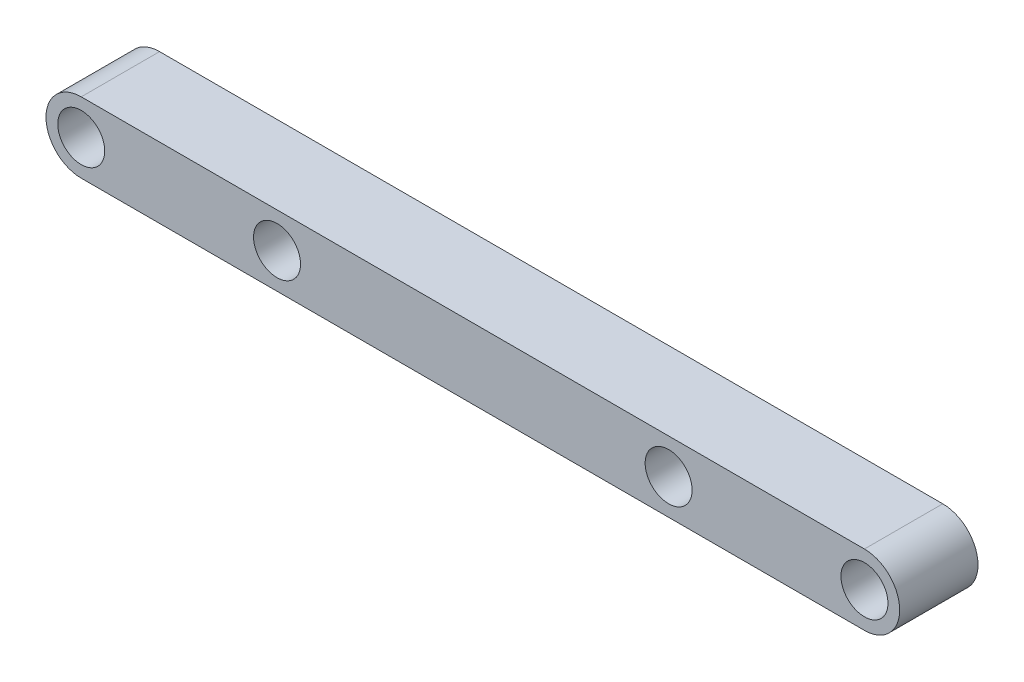
ISO-10303-21;
HEADER;
FILE_DESCRIPTION(('STEP AP214'),'2;1');
FILE_NAME('part.step','',(''),(''),'','','');
FILE_SCHEMA(('AUTOMOTIVE_DESIGN { 1 0 10303 214 1 1 1 1 }'));
ENDSEC;
DATA;
#1=APPLICATION_CONTEXT('core data for automotive mechanical design processes');
#2=APPLICATION_PROTOCOL_DEFINITION('international standard','automotive_design',2000,#1);
#3=PRODUCT_CONTEXT('',#1,'mechanical');
#4=PRODUCT('Part','Part','',(#3));
#5=PRODUCT_RELATED_PRODUCT_CATEGORY('part','',(#4));
#6=PRODUCT_DEFINITION_FORMATION('','',#4);
#7=PRODUCT_DEFINITION_CONTEXT('part definition',#1,'design');
#8=PRODUCT_DEFINITION('design','',#6,#7);
#9=PRODUCT_DEFINITION_SHAPE('','',#8);
#10=(LENGTH_UNIT() NAMED_UNIT(*) SI_UNIT(.MILLI.,.METRE.));
#11=(NAMED_UNIT(*) PLANE_ANGLE_UNIT() SI_UNIT($,.RADIAN.));
#12=(NAMED_UNIT(*) SI_UNIT($,.STERADIAN.) SOLID_ANGLE_UNIT());
#13=UNCERTAINTY_MEASURE_WITH_UNIT(LENGTH_MEASURE(1.E-05),#10,'distance_accuracy_value','');
#14=(GEOMETRIC_REPRESENTATION_CONTEXT(3) GLOBAL_UNCERTAINTY_ASSIGNED_CONTEXT((#13)) GLOBAL_UNIT_ASSIGNED_CONTEXT((#10,
#11,#12)) REPRESENTATION_CONTEXT('',''));
#15=CARTESIAN_POINT('',(0.,0.,0.));
#16=DIRECTION('',(0.,0.,1.));
#17=DIRECTION('',(1.,0.,0.));
#18=AXIS2_PLACEMENT_3D('',#15,#16,#17);
#19=CARTESIAN_POINT('',(-6.24105011933174,1.33651551312649,10.));
#20=DIRECTION('',(0.,0.,1.));
#21=DIRECTION('',(1.,0.,0.));
#22=AXIS2_PLACEMENT_3D('',#19,#20,#21);
#23=PLANE('',#22);
#24=CARTESIAN_POINT('',(93.7589498806683,1.33651551312649,10.));
#25=DIRECTION('',(0.,0.,1.));
#26=DIRECTION('',(1.,0.,0.));
#27=AXIS2_PLACEMENT_3D('',#24,#25,#26);
#28=CIRCLE('',#27,3.00000000000001);
#29=CARTESIAN_POINT('',(96.7589498806683,1.33651551312649,10.));
#30=VERTEX_POINT('',#29);
#31=EDGE_CURVE('E123',#30,#30,#28,.T.);
#32=ORIENTED_EDGE('',*,*,#31,.F.);
#33=EDGE_LOOP('',(#32));
#34=FACE_BOUND('',#33,.T.);
#35=CARTESIAN_POINT('',(-6.24105011933174,1.33651551312649,10.));
#36=DIRECTION('',(0.,0.,1.));
#37=DIRECTION('',(1.,0.,0.));
#38=AXIS2_PLACEMENT_3D('',#35,#36,#37);
#39=CIRCLE('',#38,3.);
#40=CARTESIAN_POINT('',(-3.24105011933174,1.33651551312649,10.));
#41=VERTEX_POINT('',#40);
#42=EDGE_CURVE('E102',#41,#41,#39,.T.);
#43=ORIENTED_EDGE('',*,*,#42,.F.);
#44=EDGE_LOOP('',(#43));
#45=FACE_BOUND('',#44,.T.);
#46=CARTESIAN_POINT('',(-6.24105011933174,1.33651551312649,10.));
#47=DIRECTION('',(0.,0.,1.));
#48=DIRECTION('',(1.,0.,0.));
#49=AXIS2_PLACEMENT_3D('',#46,#47,#48);
#50=CIRCLE('',#49,4.5);
#51=CARTESIAN_POINT('',(-6.24105011933174,5.83651551312649,10.));
#52=VERTEX_POINT('',#51);
#53=CARTESIAN_POINT('',(-6.24105011933174,-3.16348448687351,10.));
#54=VERTEX_POINT('',#53);
#55=EDGE_CURVE('E87',#52,#54,#50,.T.);
#56=ORIENTED_EDGE('',*,*,#55,.T.);
#57=DIRECTION('',(1.,0.,0.));
#58=VECTOR('',#57,1.);
#59=CARTESIAN_POINT('',(-6.24105011933174,-3.16348448687351,10.));
#60=LINE('',#59,#58);
#61=CARTESIAN_POINT('',(93.7589498806683,-3.16348448687351,10.));
#62=VERTEX_POINT('',#61);
#63=EDGE_CURVE('E82',#54,#62,#60,.T.);
#64=ORIENTED_EDGE('',*,*,#63,.T.);
#65=CARTESIAN_POINT('',(93.7589498806683,1.33651551312649,10.));
#66=DIRECTION('',(0.,0.,1.));
#67=DIRECTION('',(1.,0.,0.));
#68=AXIS2_PLACEMENT_3D('',#65,#66,#67);
#69=CIRCLE('',#68,4.5);
#70=CARTESIAN_POINT('',(93.7589498806683,5.83651551312649,10.));
#71=VERTEX_POINT('',#70);
#72=EDGE_CURVE('E85',#62,#71,#69,.T.);
#73=ORIENTED_EDGE('',*,*,#72,.T.);
#74=DIRECTION('',(-1.,0.,0.));
#75=VECTOR('',#74,1.);
#76=CARTESIAN_POINT('',(-6.24105011933174,5.83651551312649,10.));
#77=LINE('',#76,#75);
#78=EDGE_CURVE('E52',#71,#52,#77,.T.);
#79=ORIENTED_EDGE('',*,*,#78,.T.);
#80=EDGE_LOOP('',(#56,#64,#73,#79));
#81=FACE_BOUND('',#80,.T.);
#82=CARTESIAN_POINT('',(68.7589498806683,1.33651551312649,10.));
#83=DIRECTION('',(0.,0.,1.));
#84=DIRECTION('',(1.,0.,0.));
#85=AXIS2_PLACEMENT_3D('',#82,#83,#84);
#86=CIRCLE('',#85,3.00000000000001);
#87=CARTESIAN_POINT('',(71.7589498806683,1.33651551312649,10.));
#88=VERTEX_POINT('',#87);
#89=EDGE_CURVE('E117',#88,#88,#86,.T.);
#90=ORIENTED_EDGE('',*,*,#89,.F.);
#91=EDGE_LOOP('',(#90));
#92=FACE_BOUND('',#91,.T.);
#93=CARTESIAN_POINT('',(18.7589498806683,1.33651551312649,10.));
#94=DIRECTION('',(0.,0.,1.));
#95=DIRECTION('',(1.,0.,0.));
#96=AXIS2_PLACEMENT_3D('',#93,#94,#95);
#97=CIRCLE('',#96,3.);
#98=CARTESIAN_POINT('',(21.7589498806683,1.33651551312649,10.));
#99=VERTEX_POINT('',#98);
#100=EDGE_CURVE('E129',#99,#99,#97,.T.);
#101=ORIENTED_EDGE('',*,*,#100,.F.);
#102=EDGE_LOOP('',(#101));
#103=FACE_BOUND('',#102,.T.);
#104=ADVANCED_FACE('F35',(#34,#45,#81,#92,#103),#23,.T.);
#105=CARTESIAN_POINT('',(-6.24105011933174,1.33651551312649,0.));
#106=DIRECTION('',(0.,0.,1.));
#107=DIRECTION('',(1.,0.,0.));
#108=AXIS2_PLACEMENT_3D('',#105,#106,#107);
#109=PLANE('',#108);
#110=CARTESIAN_POINT('',(-6.24105011933174,1.33651551312649,0.));
#111=DIRECTION('',(0.,0.,1.));
#112=DIRECTION('',(1.,0.,0.));
#113=AXIS2_PLACEMENT_3D('',#110,#111,#112);
#114=CIRCLE('',#113,4.5);
#115=CARTESIAN_POINT('',(-6.24105011933174,5.83651551312649,0.));
#116=VERTEX_POINT('',#115);
#117=CARTESIAN_POINT('',(-6.24105011933174,-3.16348448687351,0.));
#118=VERTEX_POINT('',#117);
#119=EDGE_CURVE('E99',#116,#118,#114,.T.);
#120=ORIENTED_EDGE('',*,*,#119,.F.);
#121=DIRECTION('',(-1.,0.,0.));
#122=VECTOR('',#121,1.);
#123=CARTESIAN_POINT('',(-6.24105011933174,5.83651551312649,0.));
#124=LINE('',#123,#122);
#125=CARTESIAN_POINT('',(93.7589498806683,5.83651551312649,0.));
#126=VERTEX_POINT('',#125);
#127=EDGE_CURVE('E75',#126,#116,#124,.T.);
#128=ORIENTED_EDGE('',*,*,#127,.F.);
#129=CARTESIAN_POINT('',(93.7589498806683,1.33651551312649,0.));
#130=DIRECTION('',(0.,0.,1.));
#131=DIRECTION('',(1.,0.,0.));
#132=AXIS2_PLACEMENT_3D('',#129,#130,#131);
#133=CIRCLE('',#132,4.5);
#134=CARTESIAN_POINT('',(93.7589498806683,-3.16348448687351,0.));
#135=VERTEX_POINT('',#134);
#136=EDGE_CURVE('E69',#135,#126,#133,.T.);
#137=ORIENTED_EDGE('',*,*,#136,.F.);
#138=DIRECTION('',(1.,0.,0.));
#139=VECTOR('',#138,1.);
#140=CARTESIAN_POINT('',(-6.24105011933174,-3.16348448687351,0.));
#141=LINE('',#140,#139);
#142=EDGE_CURVE('E91',#118,#135,#141,.T.);
#143=ORIENTED_EDGE('',*,*,#142,.F.);
#144=EDGE_LOOP('',(#120,#128,#137,#143));
#145=FACE_BOUND('',#144,.T.);
#146=CARTESIAN_POINT('',(-6.24105011933174,1.33651551312649,0.));
#147=DIRECTION('',(0.,0.,1.));
#148=DIRECTION('',(1.,0.,0.));
#149=AXIS2_PLACEMENT_3D('',#146,#147,#148);
#150=CIRCLE('',#149,3.);
#151=CARTESIAN_POINT('',(-3.24105011933174,1.33651551312649,0.));
#152=VERTEX_POINT('',#151);
#153=EDGE_CURVE('E114',#152,#152,#150,.T.);
#154=ORIENTED_EDGE('',*,*,#153,.T.);
#155=EDGE_LOOP('',(#154));
#156=FACE_BOUND('',#155,.T.);
#157=CARTESIAN_POINT('',(68.7589498806683,1.33651551312649,0.));
#158=DIRECTION('',(0.,0.,1.));
#159=DIRECTION('',(1.,0.,0.));
#160=AXIS2_PLACEMENT_3D('',#157,#158,#159);
#161=CIRCLE('',#160,3.00000000000001);
#162=CARTESIAN_POINT('',(71.7589498806683,1.33651551312649,0.));
#163=VERTEX_POINT('',#162);
#164=EDGE_CURVE('E120',#163,#163,#161,.T.);
#165=ORIENTED_EDGE('',*,*,#164,.T.);
#166=EDGE_LOOP('',(#165));
#167=FACE_BOUND('',#166,.T.);
#168=CARTESIAN_POINT('',(93.7589498806683,1.33651551312649,0.));
#169=DIRECTION('',(0.,0.,1.));
#170=DIRECTION('',(1.,0.,0.));
#171=AXIS2_PLACEMENT_3D('',#168,#169,#170);
#172=CIRCLE('',#171,3.00000000000001);
#173=CARTESIAN_POINT('',(96.7589498806683,1.33651551312649,0.));
#174=VERTEX_POINT('',#173);
#175=EDGE_CURVE('E126',#174,#174,#172,.T.);
#176=ORIENTED_EDGE('',*,*,#175,.T.);
#177=EDGE_LOOP('',(#176));
#178=FACE_BOUND('',#177,.T.);
#179=CARTESIAN_POINT('',(18.7589498806683,1.33651551312649,0.));
#180=DIRECTION('',(0.,0.,1.));
#181=DIRECTION('',(1.,0.,0.));
#182=AXIS2_PLACEMENT_3D('',#179,#180,#181);
#183=CIRCLE('',#182,3.);
#184=CARTESIAN_POINT('',(21.7589498806683,1.33651551312649,0.));
#185=VERTEX_POINT('',#184);
#186=EDGE_CURVE('E132',#185,#185,#183,.T.);
#187=ORIENTED_EDGE('',*,*,#186,.T.);
#188=EDGE_LOOP('',(#187));
#189=FACE_BOUND('',#188,.T.);
#190=ADVANCED_FACE('F110',(#145,#156,#167,#178,#189),#109,.F.);
#191=CARTESIAN_POINT('',(-6.24105011933174,1.33651551312649,10.));
#192=DIRECTION('',(0.,0.,-1.));
#193=DIRECTION('',(-1.,0.,0.));
#194=AXIS2_PLACEMENT_3D('',#191,#192,#193);
#195=CYLINDRICAL_SURFACE('',#194,4.5);
#196=ORIENTED_EDGE('',*,*,#119,.T.);
#197=DIRECTION('',(0.,0.,-1.));
#198=VECTOR('',#197,1.);
#199=CARTESIAN_POINT('',(-6.24105011933174,-3.16348448687351,10.));
#200=LINE('',#199,#198);
#201=EDGE_CURVE('E11',#54,#118,#200,.T.);
#202=ORIENTED_EDGE('',*,*,#201,.F.);
#203=ORIENTED_EDGE('',*,*,#55,.F.);
#204=DIRECTION('',(0.,0.,-1.));
#205=VECTOR('',#204,1.);
#206=CARTESIAN_POINT('',(-6.24105011933174,5.83651551312649,10.));
#207=LINE('',#206,#205);
#208=EDGE_CURVE('E95',#52,#116,#207,.T.);
#209=ORIENTED_EDGE('',*,*,#208,.T.);
#210=EDGE_LOOP('',(#196,#202,#203,#209));
#211=FACE_BOUND('',#210,.T.);
#212=ADVANCED_FACE('F37',(#211),#195,.T.);
#213=CARTESIAN_POINT('',(-6.24105011933174,-3.16348448687351,10.));
#214=DIRECTION('',(0.,1.,0.));
#215=DIRECTION('',(0.,0.,1.));
#216=AXIS2_PLACEMENT_3D('',#213,#214,#215);
#217=PLANE('',#216);
#218=ORIENTED_EDGE('',*,*,#142,.T.);
#219=DIRECTION('',(0.,0.,-1.));
#220=VECTOR('',#219,1.);
#221=CARTESIAN_POINT('',(93.7589498806683,-3.16348448687351,10.));
#222=LINE('',#221,#220);
#223=EDGE_CURVE('E44',#62,#135,#222,.T.);
#224=ORIENTED_EDGE('',*,*,#223,.F.);
#225=ORIENTED_EDGE('',*,*,#63,.F.);
#226=ORIENTED_EDGE('',*,*,#201,.T.);
#227=EDGE_LOOP('',(#218,#224,#225,#226));
#228=FACE_BOUND('',#227,.T.);
#229=ADVANCED_FACE('F90',(#228),#217,.F.);
#230=CARTESIAN_POINT('',(93.7589498806683,1.33651551312649,10.));
#231=DIRECTION('',(0.,0.,-1.));
#232=DIRECTION('',(-1.,0.,0.));
#233=AXIS2_PLACEMENT_3D('',#230,#231,#232);
#234=CYLINDRICAL_SURFACE('',#233,4.5);
#235=ORIENTED_EDGE('',*,*,#136,.T.);
#236=DIRECTION('',(0.,0.,-1.));
#237=VECTOR('',#236,1.);
#238=CARTESIAN_POINT('',(93.7589498806683,5.83651551312649,10.));
#239=LINE('',#238,#237);
#240=EDGE_CURVE('E92',#71,#126,#239,.T.);
#241=ORIENTED_EDGE('',*,*,#240,.F.);
#242=ORIENTED_EDGE('',*,*,#72,.F.);
#243=ORIENTED_EDGE('',*,*,#223,.T.);
#244=EDGE_LOOP('',(#235,#241,#242,#243));
#245=FACE_BOUND('',#244,.T.);
#246=ADVANCED_FACE('F93',(#245),#234,.T.);
#247=CARTESIAN_POINT('',(-6.24105011933174,5.83651551312649,10.));
#248=DIRECTION('',(0.,-1.,0.));
#249=DIRECTION('',(0.,0.,-1.));
#250=AXIS2_PLACEMENT_3D('',#247,#248,#249);
#251=PLANE('',#250);
#252=ORIENTED_EDGE('',*,*,#127,.T.);
#253=ORIENTED_EDGE('',*,*,#208,.F.);
#254=ORIENTED_EDGE('',*,*,#78,.F.);
#255=ORIENTED_EDGE('',*,*,#240,.T.);
#256=EDGE_LOOP('',(#252,#253,#254,#255));
#257=FACE_BOUND('',#256,.T.);
#258=ADVANCED_FACE('F107',(#257),#251,.F.);
#259=CARTESIAN_POINT('',(-6.24105011933174,1.33651551312649,10.));
#260=DIRECTION('',(0.,0.,-1.));
#261=DIRECTION('',(-1.,0.,0.));
#262=AXIS2_PLACEMENT_3D('',#259,#260,#261);
#263=CYLINDRICAL_SURFACE('',#262,3.);
#264=ORIENTED_EDGE('',*,*,#42,.T.);
#265=EDGE_LOOP('',(#264));
#266=FACE_BOUND('',#265,.T.);
#267=ORIENTED_EDGE('',*,*,#153,.F.);
#268=EDGE_LOOP('',(#267));
#269=FACE_BOUND('',#268,.T.);
#270=ADVANCED_FACE('F151',(#266,#269),#263,.F.);
#271=CARTESIAN_POINT('',(68.7589498806683,1.33651551312649,10.));
#272=DIRECTION('',(0.,0.,-1.));
#273=DIRECTION('',(-1.,0.,0.));
#274=AXIS2_PLACEMENT_3D('',#271,#272,#273);
#275=CYLINDRICAL_SURFACE('',#274,3.00000000000001);
#276=ORIENTED_EDGE('',*,*,#89,.T.);
#277=EDGE_LOOP('',(#276));
#278=FACE_BOUND('',#277,.T.);
#279=ORIENTED_EDGE('',*,*,#164,.F.);
#280=EDGE_LOOP('',(#279));
#281=FACE_BOUND('',#280,.T.);
#282=ADVANCED_FACE('F197',(#278,#281),#275,.F.);
#283=CARTESIAN_POINT('',(93.7589498806683,1.33651551312649,10.));
#284=DIRECTION('',(0.,0.,-1.));
#285=DIRECTION('',(-1.,0.,0.));
#286=AXIS2_PLACEMENT_3D('',#283,#284,#285);
#287=CYLINDRICAL_SURFACE('',#286,3.00000000000001);
#288=ORIENTED_EDGE('',*,*,#31,.T.);
#289=EDGE_LOOP('',(#288));
#290=FACE_BOUND('',#289,.T.);
#291=ORIENTED_EDGE('',*,*,#175,.F.);
#292=EDGE_LOOP('',(#291));
#293=FACE_BOUND('',#292,.T.);
#294=ADVANCED_FACE('F205',(#290,#293),#287,.F.);
#295=CARTESIAN_POINT('',(18.7589498806683,1.33651551312649,10.));
#296=DIRECTION('',(0.,0.,-1.));
#297=DIRECTION('',(-1.,0.,0.));
#298=AXIS2_PLACEMENT_3D('',#295,#296,#297);
#299=CYLINDRICAL_SURFACE('',#298,3.);
#300=ORIENTED_EDGE('',*,*,#100,.T.);
#301=EDGE_LOOP('',(#300));
#302=FACE_BOUND('',#301,.T.);
#303=ORIENTED_EDGE('',*,*,#186,.F.);
#304=EDGE_LOOP('',(#303));
#305=FACE_BOUND('',#304,.T.);
#306=ADVANCED_FACE('F138',(#302,#305),#299,.F.);
#307=CLOSED_SHELL('',(#104,#190,#212,#229,#246,#258,#270,#282,#294,#306));
#308=MANIFOLD_SOLID_BREP('B2',#307);
#309=ADVANCED_BREP_SHAPE_REPRESENTATION('',(#18,#308),#14);
#310=SHAPE_DEFINITION_REPRESENTATION(#9,#309);
ENDSEC;
END-ISO-10303-21;
